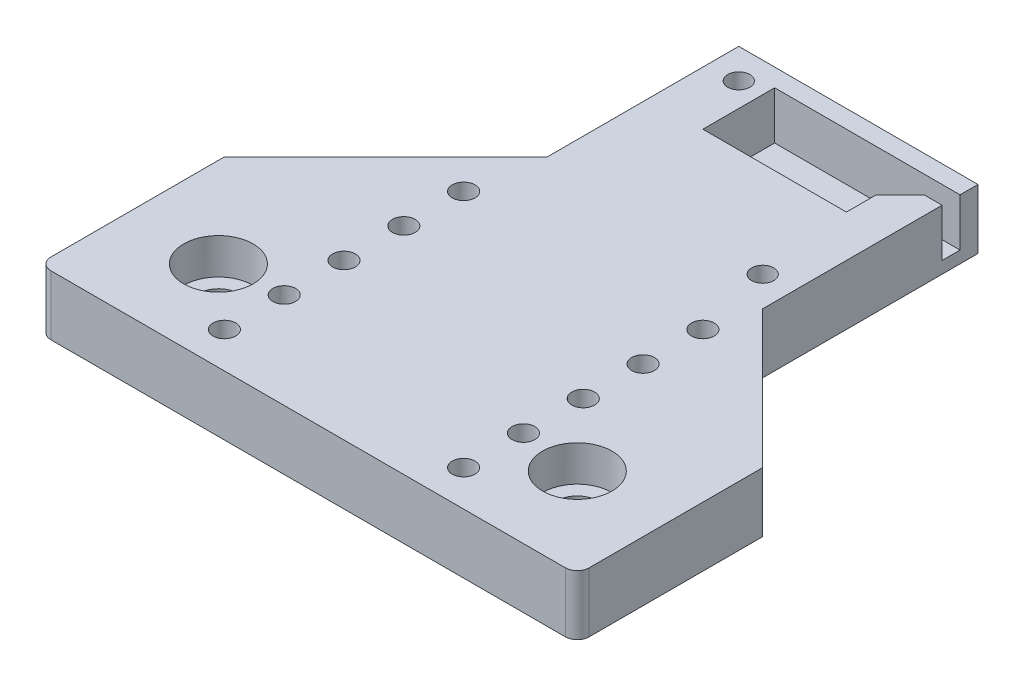
ISO-10303-21;
HEADER;
FILE_DESCRIPTION(('STEP AP214'),'2;1');
FILE_NAME('part.step','',(''),(''),'','','');
FILE_SCHEMA(('AUTOMOTIVE_DESIGN { 1 0 10303 214 1 1 1 1 }'));
ENDSEC;
DATA;
#1=APPLICATION_CONTEXT('core data for automotive mechanical design processes');
#2=APPLICATION_PROTOCOL_DEFINITION('international standard','automotive_design',2000,#1);
#3=PRODUCT_CONTEXT('',#1,'mechanical');
#4=PRODUCT('Part','Part','',(#3));
#5=PRODUCT_RELATED_PRODUCT_CATEGORY('part','',(#4));
#6=PRODUCT_DEFINITION_FORMATION('','',#4);
#7=PRODUCT_DEFINITION_CONTEXT('part definition',#1,'design');
#8=PRODUCT_DEFINITION('design','',#6,#7);
#9=PRODUCT_DEFINITION_SHAPE('','',#8);
#10=(LENGTH_UNIT() NAMED_UNIT(*) SI_UNIT(.MILLI.,.METRE.));
#11=(NAMED_UNIT(*) PLANE_ANGLE_UNIT() SI_UNIT($,.RADIAN.));
#12=(NAMED_UNIT(*) SI_UNIT($,.STERADIAN.) SOLID_ANGLE_UNIT());
#13=UNCERTAINTY_MEASURE_WITH_UNIT(LENGTH_MEASURE(1.E-05),#10,'distance_accuracy_value','');
#14=(GEOMETRIC_REPRESENTATION_CONTEXT(3) GLOBAL_UNCERTAINTY_ASSIGNED_CONTEXT((#13)) GLOBAL_UNIT_ASSIGNED_CONTEXT((#10,
#11,#12)) REPRESENTATION_CONTEXT('',''));
#15=CARTESIAN_POINT('',(0.,0.,0.));
#16=DIRECTION('',(0.,0.,1.));
#17=DIRECTION('',(1.,0.,0.));
#18=AXIS2_PLACEMENT_3D('',#15,#16,#17);
#19=CARTESIAN_POINT('',(0.,5.,0.));
#20=DIRECTION('',(0.,-1.,0.));
#21=DIRECTION('',(0.,0.,-1.));
#22=AXIS2_PLACEMENT_3D('',#19,#20,#21);
#23=PLANE('',#22);
#24=DIRECTION('',(0.,0.,-1.));
#25=VECTOR('',#24,1.);
#26=CARTESIAN_POINT('',(22.5,5.,22.5));
#27=LINE('',#26,#25);
#28=CARTESIAN_POINT('',(22.5,5.,21.5));
#29=VERTEX_POINT('',#28);
#30=CARTESIAN_POINT('',(22.5,5.,7.0000000000001));
#31=VERTEX_POINT('',#30);
#32=EDGE_CURVE('E188',#29,#31,#27,.T.);
#33=ORIENTED_EDGE('',*,*,#32,.T.);
#34=DIRECTION('',(0.707106781186544,0.,0.707106781186551));
#35=VECTOR('',#34,1.);
#36=CARTESIAN_POINT('',(11.,5.,-4.5));
#37=LINE('',#36,#35);
#38=CARTESIAN_POINT('',(11.,5.,-4.5));
#39=VERTEX_POINT('',#38);
#40=EDGE_CURVE('E161',#39,#31,#37,.T.);
#41=ORIENTED_EDGE('',*,*,#40,.F.);
#42=DIRECTION('',(0.,0.,1.));
#43=VECTOR('',#42,1.);
#44=CARTESIAN_POINT('',(11.,5.,-22.5));
#45=LINE('',#44,#43);
#46=CARTESIAN_POINT('',(11.,5.,-19.5));
#47=VERTEX_POINT('',#46);
#48=EDGE_CURVE('E393',#47,#39,#45,.T.);
#49=ORIENTED_EDGE('',*,*,#48,.F.);
#50=DIRECTION('',(1.,0.,0.));
#51=VECTOR('',#50,1.);
#52=CARTESIAN_POINT('',(15.5,5.,-19.5));
#53=LINE('',#52,#51);
#54=CARTESIAN_POINT('',(9.49999999999999,5.,-19.5));
#55=VERTEX_POINT('',#54);
#56=EDGE_CURVE('E291',#55,#47,#53,.T.);
#57=ORIENTED_EDGE('',*,*,#56,.F.);
#58=DIRECTION('',(0.707106781186545,0.,-0.70710678118655));
#59=VECTOR('',#58,1.);
#60=CARTESIAN_POINT('',(9.49999999999999,5.,-19.5));
#61=LINE('',#60,#59);
#62=CARTESIAN_POINT('',(7.5,5.,-17.5));
#63=VERTEX_POINT('',#62);
#64=EDGE_CURVE('E259',#55,#63,#61,.F.);
#65=ORIENTED_EDGE('',*,*,#64,.T.);
#66=DIRECTION('',(0.,0.,-1.));
#67=VECTOR('',#66,1.);
#68=CARTESIAN_POINT('',(7.5,5.,-19.5));
#69=LINE('',#68,#67);
#70=CARTESIAN_POINT('',(7.5,5.,-15.));
#71=VERTEX_POINT('',#70);
#72=EDGE_CURVE('E289',#71,#63,#69,.T.);
#73=ORIENTED_EDGE('',*,*,#72,.F.);
#74=DIRECTION('',(1.,0.,0.));
#75=VECTOR('',#74,1.);
#76=CARTESIAN_POINT('',(-4.5,5.,-15.));
#77=LINE('',#76,#75);
#78=CARTESIAN_POINT('',(-4.5,5.,-15.));
#79=VERTEX_POINT('',#78);
#80=EDGE_CURVE('E297',#79,#71,#77,.T.);
#81=ORIENTED_EDGE('',*,*,#80,.F.);
#82=DIRECTION('',(0.,0.,1.));
#83=VECTOR('',#82,1.);
#84=CARTESIAN_POINT('',(-4.5,5.,-21.));
#85=LINE('',#84,#83);
#86=CARTESIAN_POINT('',(-4.5,5.,-21.));
#87=VERTEX_POINT('',#86);
#88=EDGE_CURVE('E301',#87,#79,#85,.T.);
#89=ORIENTED_EDGE('',*,*,#88,.F.);
#90=DIRECTION('',(-1.,0.,0.));
#91=VECTOR('',#90,1.);
#92=CARTESIAN_POINT('',(-4.5,5.,-21.));
#93=LINE('',#92,#91);
#94=CARTESIAN_POINT('',(11.,5.,-21.));
#95=VERTEX_POINT('',#94);
#96=EDGE_CURVE('E299',#95,#87,#93,.T.);
#97=ORIENTED_EDGE('',*,*,#96,.F.);
#98=CARTESIAN_POINT('',(11.,5.,-22.5));
#99=VERTEX_POINT('',#98);
#100=EDGE_CURVE('E49',#99,#95,#45,.T.);
#101=ORIENTED_EDGE('',*,*,#100,.F.);
#102=DIRECTION('',(-1.,0.,0.));
#103=VECTOR('',#102,1.);
#104=CARTESIAN_POINT('',(-22.5,5.,-22.5));
#105=LINE('',#104,#103);
#106=CARTESIAN_POINT('',(-9.00000000000001,5.,-22.5));
#107=VERTEX_POINT('',#106);
#108=EDGE_CURVE('E169',#99,#107,#105,.T.);
#109=ORIENTED_EDGE('',*,*,#108,.T.);
#110=DIRECTION('',(0.,0.,-1.));
#111=VECTOR('',#110,1.);
#112=CARTESIAN_POINT('',(-9.00000000000001,5.,-22.5));
#113=LINE('',#112,#111);
#114=CARTESIAN_POINT('',(-9.00000000000001,5.,-6.49999999999985));
#115=VERTEX_POINT('',#114);
#116=EDGE_CURVE('E403',#115,#107,#113,.T.);
#117=ORIENTED_EDGE('',*,*,#116,.F.);
#118=DIRECTION('',(0.707106781186549,0.,-0.707106781186546));
#119=VECTOR('',#118,1.);
#120=CARTESIAN_POINT('',(-9.00000000000001,5.,-6.49999999999985));
#121=LINE('',#120,#119);
#122=CARTESIAN_POINT('',(-22.5,5.,7.0000000000001));
#123=VERTEX_POINT('',#122);
#124=EDGE_CURVE('E401',#123,#115,#121,.T.);
#125=ORIENTED_EDGE('',*,*,#124,.F.);
#126=DIRECTION('',(0.,0.,1.));
#127=VECTOR('',#126,1.);
#128=CARTESIAN_POINT('',(-22.5,5.,22.5));
#129=LINE('',#128,#127);
#130=CARTESIAN_POINT('',(-22.5,5.,21.5));
#131=VERTEX_POINT('',#130);
#132=EDGE_CURVE('E372',#123,#131,#129,.T.);
#133=ORIENTED_EDGE('',*,*,#132,.T.);
#134=CARTESIAN_POINT('',(-21.5,5.,21.5));
#135=DIRECTION('',(0.,-1.,0.));
#136=DIRECTION('',(0.,0.,-1.));
#137=AXIS2_PLACEMENT_3D('',#134,#135,#136);
#138=CIRCLE('',#137,1.);
#139=CARTESIAN_POINT('',(-21.5,5.,22.5));
#140=VERTEX_POINT('',#139);
#141=EDGE_CURVE('E246',#131,#140,#138,.F.);
#142=ORIENTED_EDGE('',*,*,#141,.T.);
#143=DIRECTION('',(1.,0.,0.));
#144=VECTOR('',#143,1.);
#145=CARTESIAN_POINT('',(-22.5,5.,22.5));
#146=LINE('',#145,#144);
#147=CARTESIAN_POINT('',(21.5,5.,22.5));
#148=VERTEX_POINT('',#147);
#149=EDGE_CURVE('E203',#140,#148,#146,.T.);
#150=ORIENTED_EDGE('',*,*,#149,.T.);
#151=CARTESIAN_POINT('',(21.5,5.,21.5));
#152=DIRECTION('',(0.,-1.,0.));
#153=DIRECTION('',(0.,0.,-1.));
#154=AXIS2_PLACEMENT_3D('',#151,#152,#153);
#155=CIRCLE('',#154,1.);
#156=EDGE_CURVE('E244',#148,#29,#155,.F.);
#157=ORIENTED_EDGE('',*,*,#156,.T.);
#158=EDGE_LOOP('',(#33,#41,#49,#57,#65,#73,#81,#89,#97,#101,#109,#117,#125,#133,#142,#150,#157));
#159=FACE_BOUND('',#158,.T.);
#160=CARTESIAN_POINT('',(-10.,5.,14.5));
#161=DIRECTION('',(0.,1.,0.));
#162=DIRECTION('',(0.,0.,1.));
#163=AXIS2_PLACEMENT_3D('',#160,#161,#162);
#164=CIRCLE('',#163,0.949999999999999);
#165=CARTESIAN_POINT('',(-10.,5.,15.45));
#166=VERTEX_POINT('',#165);
#167=EDGE_CURVE('E324',#166,#166,#164,.T.);
#168=ORIENTED_EDGE('',*,*,#167,.F.);
#169=EDGE_LOOP('',(#168));
#170=FACE_BOUND('',#169,.T.);
#171=CARTESIAN_POINT('',(10.,5.,14.5));
#172=DIRECTION('',(0.,1.,0.));
#173=DIRECTION('',(0.,0.,-1.));
#174=AXIS2_PLACEMENT_3D('',#171,#172,#173);
#175=CIRCLE('',#174,0.949999999999999);
#176=CARTESIAN_POINT('',(10.,5.,13.55));
#177=VERTEX_POINT('',#176);
#178=EDGE_CURVE('E330',#177,#177,#175,.T.);
#179=ORIENTED_EDGE('',*,*,#178,.F.);
#180=EDGE_LOOP('',(#179));
#181=FACE_BOUND('',#180,.T.);
#182=CARTESIAN_POINT('',(10.,5.,19.5));
#183=DIRECTION('',(0.,1.,0.));
#184=DIRECTION('',(0.,0.,-1.));
#185=AXIS2_PLACEMENT_3D('',#182,#183,#184);
#186=CIRCLE('',#185,0.949999999999999);
#187=CARTESIAN_POINT('',(10.,5.,18.55));
#188=VERTEX_POINT('',#187);
#189=EDGE_CURVE('E333',#188,#188,#186,.T.);
#190=ORIENTED_EDGE('',*,*,#189,.F.);
#191=EDGE_LOOP('',(#190));
#192=FACE_BOUND('',#191,.T.);
#193=CARTESIAN_POINT('',(-10.,5.,19.5));
#194=DIRECTION('',(0.,1.,0.));
#195=DIRECTION('',(0.,0.,1.));
#196=AXIS2_PLACEMENT_3D('',#193,#194,#195);
#197=CIRCLE('',#196,0.949999999999999);
#198=CARTESIAN_POINT('',(-10.,5.,20.45));
#199=VERTEX_POINT('',#198);
#200=EDGE_CURVE('E337',#199,#199,#197,.T.);
#201=ORIENTED_EDGE('',*,*,#200,.F.);
#202=EDGE_LOOP('',(#201));
#203=FACE_BOUND('',#202,.T.);
#204=CARTESIAN_POINT('',(8.49999999999999,5.,-7.));
#205=DIRECTION('',(0.,1.,0.));
#206=DIRECTION('',(0.,0.,1.));
#207=AXIS2_PLACEMENT_3D('',#204,#205,#206);
#208=CIRCLE('',#207,0.925000000000001);
#209=CARTESIAN_POINT('',(8.49999999999999,5.,-6.075));
#210=VERTEX_POINT('',#209);
#211=EDGE_CURVE('E343',#210,#210,#208,.T.);
#212=ORIENTED_EDGE('',*,*,#211,.F.);
#213=EDGE_LOOP('',(#212));
#214=FACE_BOUND('',#213,.T.);
#215=CARTESIAN_POINT('',(-6.50000000000001,5.,-20.));
#216=DIRECTION('',(0.,1.,0.));
#217=DIRECTION('',(0.,0.,1.));
#218=AXIS2_PLACEMENT_3D('',#215,#216,#217);
#219=CIRCLE('',#218,0.925);
#220=CARTESIAN_POINT('',(-6.50000000000001,5.,-19.075));
#221=VERTEX_POINT('',#220);
#222=EDGE_CURVE('E349',#221,#221,#219,.T.);
#223=ORIENTED_EDGE('',*,*,#222,.F.);
#224=EDGE_LOOP('',(#223));
#225=FACE_BOUND('',#224,.T.);
#226=CARTESIAN_POINT('',(15.,5.,15.));
#227=DIRECTION('',(0.,1.,0.));
#228=DIRECTION('',(0.,0.,1.));
#229=AXIS2_PLACEMENT_3D('',#226,#227,#228);
#230=CIRCLE('',#229,2.9);
#231=CARTESIAN_POINT('',(15.,5.,17.9));
#232=VERTEX_POINT('',#231);
#233=EDGE_CURVE('E355',#232,#232,#230,.T.);
#234=ORIENTED_EDGE('',*,*,#233,.F.);
#235=EDGE_LOOP('',(#234));
#236=FACE_BOUND('',#235,.T.);
#237=CARTESIAN_POINT('',(-15.,5.,15.));
#238=DIRECTION('',(0.,1.,0.));
#239=DIRECTION('',(0.,0.,1.));
#240=AXIS2_PLACEMENT_3D('',#237,#238,#239);
#241=CIRCLE('',#240,2.9);
#242=CARTESIAN_POINT('',(-15.,5.,17.9));
#243=VERTEX_POINT('',#242);
#244=EDGE_CURVE('E197',#243,#243,#241,.T.);
#245=ORIENTED_EDGE('',*,*,#244,.F.);
#246=EDGE_LOOP('',(#245));
#247=FACE_BOUND('',#246,.T.);
#248=CARTESIAN_POINT('',(10.,5.,9.49999999999999));
#249=DIRECTION('',(0.,1.,0.));
#250=DIRECTION('',(0.,0.,-1.));
#251=AXIS2_PLACEMENT_3D('',#248,#249,#250);
#252=CIRCLE('',#251,0.949999999999999);
#253=CARTESIAN_POINT('',(10.,5.,8.55));
#254=VERTEX_POINT('',#253);
#255=EDGE_CURVE('E202',#254,#254,#252,.T.);
#256=ORIENTED_EDGE('',*,*,#255,.F.);
#257=EDGE_LOOP('',(#256));
#258=FACE_BOUND('',#257,.T.);
#259=CARTESIAN_POINT('',(10.,5.,4.5));
#260=DIRECTION('',(0.,1.,0.));
#261=DIRECTION('',(0.,0.,-1.));
#262=AXIS2_PLACEMENT_3D('',#259,#260,#261);
#263=CIRCLE('',#262,0.949999999999999);
#264=CARTESIAN_POINT('',(10.,5.,3.55));
#265=VERTEX_POINT('',#264);
#266=EDGE_CURVE('E209',#265,#265,#263,.T.);
#267=ORIENTED_EDGE('',*,*,#266,.F.);
#268=EDGE_LOOP('',(#267));
#269=FACE_BOUND('',#268,.T.);
#270=CARTESIAN_POINT('',(10.,5.,-0.500000000000004));
#271=DIRECTION('',(0.,1.,0.));
#272=DIRECTION('',(0.,0.,-1.));
#273=AXIS2_PLACEMENT_3D('',#270,#271,#272);
#274=CIRCLE('',#273,0.949999999999999);
#275=CARTESIAN_POINT('',(10.,5.,-1.45));
#276=VERTEX_POINT('',#275);
#277=EDGE_CURVE('E215',#276,#276,#274,.T.);
#278=ORIENTED_EDGE('',*,*,#277,.F.);
#279=EDGE_LOOP('',(#278));
#280=FACE_BOUND('',#279,.T.);
#281=CARTESIAN_POINT('',(-10.,5.,9.5));
#282=DIRECTION('',(0.,1.,0.));
#283=DIRECTION('',(0.,0.,1.));
#284=AXIS2_PLACEMENT_3D('',#281,#282,#283);
#285=CIRCLE('',#284,0.949999999999999);
#286=CARTESIAN_POINT('',(-10.,5.,10.45));
#287=VERTEX_POINT('',#286);
#288=EDGE_CURVE('E221',#287,#287,#285,.T.);
#289=ORIENTED_EDGE('',*,*,#288,.F.);
#290=EDGE_LOOP('',(#289));
#291=FACE_BOUND('',#290,.T.);
#292=CARTESIAN_POINT('',(-10.,5.,4.5));
#293=DIRECTION('',(0.,1.,0.));
#294=DIRECTION('',(0.,0.,1.));
#295=AXIS2_PLACEMENT_3D('',#292,#293,#294);
#296=CIRCLE('',#295,0.949999999999999);
#297=CARTESIAN_POINT('',(-10.,5.,5.45));
#298=VERTEX_POINT('',#297);
#299=EDGE_CURVE('E227',#298,#298,#296,.T.);
#300=ORIENTED_EDGE('',*,*,#299,.F.);
#301=EDGE_LOOP('',(#300));
#302=FACE_BOUND('',#301,.T.);
#303=CARTESIAN_POINT('',(-10.,5.,-0.5));
#304=DIRECTION('',(0.,1.,0.));
#305=DIRECTION('',(0.,0.,1.));
#306=AXIS2_PLACEMENT_3D('',#303,#304,#305);
#307=CIRCLE('',#306,0.949999999999999);
#308=CARTESIAN_POINT('',(-10.,5.,0.449999999999999));
#309=VERTEX_POINT('',#308);
#310=EDGE_CURVE('E233',#309,#309,#307,.T.);
#311=ORIENTED_EDGE('',*,*,#310,.F.);
#312=EDGE_LOOP('',(#311));
#313=FACE_BOUND('',#312,.T.);
#314=ADVANCED_FACE('F34',(#159,#170,#181,#192,#203,#214,#225,#236,#247,#258,#269,#280,#291,#302,
#313),#23,.F.);
#315=CARTESIAN_POINT('',(0.,0.,0.));
#316=DIRECTION('',(0.,-1.,0.));
#317=DIRECTION('',(0.,0.,-1.));
#318=AXIS2_PLACEMENT_3D('',#315,#316,#317);
#319=PLANE('',#318);
#320=DIRECTION('',(0.707106781186544,0.,0.707106781186551));
#321=VECTOR('',#320,1.);
#322=CARTESIAN_POINT('',(11.,0.,-4.5));
#323=LINE('',#322,#321);
#324=CARTESIAN_POINT('',(11.,0.,-4.5));
#325=VERTEX_POINT('',#324);
#326=CARTESIAN_POINT('',(22.5,0.,7.0000000000001));
#327=VERTEX_POINT('',#326);
#328=EDGE_CURVE('E160',#325,#327,#323,.T.);
#329=ORIENTED_EDGE('',*,*,#328,.T.);
#330=DIRECTION('',(0.,0.,-1.));
#331=VECTOR('',#330,1.);
#332=CARTESIAN_POINT('',(22.5,0.,22.5));
#333=LINE('',#332,#331);
#334=CARTESIAN_POINT('',(22.5,0.,21.5));
#335=VERTEX_POINT('',#334);
#336=EDGE_CURVE('E177',#335,#327,#333,.T.);
#337=ORIENTED_EDGE('',*,*,#336,.F.);
#338=CARTESIAN_POINT('',(21.5,0.,21.5));
#339=DIRECTION('',(0.,-1.,0.));
#340=DIRECTION('',(0.,0.,-1.));
#341=AXIS2_PLACEMENT_3D('',#338,#339,#340);
#342=CIRCLE('',#341,1.);
#343=CARTESIAN_POINT('',(21.5,0.,22.5));
#344=VERTEX_POINT('',#343);
#345=EDGE_CURVE('E239',#335,#344,#342,.T.);
#346=ORIENTED_EDGE('',*,*,#345,.T.);
#347=DIRECTION('',(1.,0.,0.));
#348=VECTOR('',#347,1.);
#349=CARTESIAN_POINT('',(-22.5,0.,22.5));
#350=LINE('',#349,#348);
#351=CARTESIAN_POINT('',(-21.5,0.,22.5));
#352=VERTEX_POINT('',#351);
#353=EDGE_CURVE('E179',#352,#344,#350,.T.);
#354=ORIENTED_EDGE('',*,*,#353,.F.);
#355=CARTESIAN_POINT('',(-21.5,0.,21.5));
#356=DIRECTION('',(0.,-1.,0.));
#357=DIRECTION('',(0.,0.,-1.));
#358=AXIS2_PLACEMENT_3D('',#355,#356,#357);
#359=CIRCLE('',#358,1.);
#360=CARTESIAN_POINT('',(-22.5,0.,21.5));
#361=VERTEX_POINT('',#360);
#362=EDGE_CURVE('E241',#352,#361,#359,.T.);
#363=ORIENTED_EDGE('',*,*,#362,.T.);
#364=DIRECTION('',(0.,0.,1.));
#365=VECTOR('',#364,1.);
#366=CARTESIAN_POINT('',(-22.5,0.,22.5));
#367=LINE('',#366,#365);
#368=CARTESIAN_POINT('',(-22.5,0.,7.00000000000011));
#369=VERTEX_POINT('',#368);
#370=EDGE_CURVE('E176',#369,#361,#367,.T.);
#371=ORIENTED_EDGE('',*,*,#370,.F.);
#372=DIRECTION('',(0.707106781186549,0.,-0.707106781186546));
#373=VECTOR('',#372,1.);
#374=CARTESIAN_POINT('',(-9.00000000000001,0.,-6.49999999999985));
#375=LINE('',#374,#373);
#376=CARTESIAN_POINT('',(-9.00000000000001,0.,-6.49999999999985));
#377=VERTEX_POINT('',#376);
#378=EDGE_CURVE('E56',#369,#377,#375,.T.);
#379=ORIENTED_EDGE('',*,*,#378,.T.);
#380=DIRECTION('',(0.,0.,-1.));
#381=VECTOR('',#380,1.);
#382=CARTESIAN_POINT('',(-9.00000000000001,0.,-22.5));
#383=LINE('',#382,#381);
#384=CARTESIAN_POINT('',(-9.00000000000001,0.,-22.5));
#385=VERTEX_POINT('',#384);
#386=EDGE_CURVE('E175',#377,#385,#383,.T.);
#387=ORIENTED_EDGE('',*,*,#386,.T.);
#388=DIRECTION('',(-1.,0.,0.));
#389=VECTOR('',#388,1.);
#390=CARTESIAN_POINT('',(-22.5,0.,-22.5));
#391=LINE('',#390,#389);
#392=CARTESIAN_POINT('',(11.,0.,-22.5));
#393=VERTEX_POINT('',#392);
#394=EDGE_CURVE('E167',#393,#385,#391,.T.);
#395=ORIENTED_EDGE('',*,*,#394,.F.);
#396=DIRECTION('',(0.,0.,1.));
#397=VECTOR('',#396,1.);
#398=CARTESIAN_POINT('',(11.,0.,-22.5));
#399=LINE('',#398,#397);
#400=EDGE_CURVE('E150',#393,#325,#399,.T.);
#401=ORIENTED_EDGE('',*,*,#400,.T.);
#402=EDGE_LOOP('',(#329,#337,#346,#354,#363,#371,#379,#387,#395,#401));
#403=FACE_BOUND('',#402,.T.);
#404=CARTESIAN_POINT('',(-10.,0.,14.5));
#405=DIRECTION('',(0.,1.,0.));
#406=DIRECTION('',(0.,0.,1.));
#407=AXIS2_PLACEMENT_3D('',#404,#405,#406);
#408=CIRCLE('',#407,0.949999999999999);
#409=CARTESIAN_POINT('',(-10.,0.,15.45));
#410=VERTEX_POINT('',#409);
#411=EDGE_CURVE('E321',#410,#410,#408,.T.);
#412=ORIENTED_EDGE('',*,*,#411,.T.);
#413=EDGE_LOOP('',(#412));
#414=FACE_BOUND('',#413,.T.);
#415=CARTESIAN_POINT('',(10.,0.,14.5));
#416=DIRECTION('',(0.,1.,0.));
#417=DIRECTION('',(0.,0.,-1.));
#418=AXIS2_PLACEMENT_3D('',#415,#416,#417);
#419=CIRCLE('',#418,0.949999999999999);
#420=CARTESIAN_POINT('',(10.,0.,13.55));
#421=VERTEX_POINT('',#420);
#422=EDGE_CURVE('E327',#421,#421,#419,.T.);
#423=ORIENTED_EDGE('',*,*,#422,.T.);
#424=EDGE_LOOP('',(#423));
#425=FACE_BOUND('',#424,.T.);
#426=CARTESIAN_POINT('',(10.,0.,19.5));
#427=DIRECTION('',(0.,1.,0.));
#428=DIRECTION('',(0.,0.,-1.));
#429=AXIS2_PLACEMENT_3D('',#426,#427,#428);
#430=CIRCLE('',#429,0.949999999999999);
#431=CARTESIAN_POINT('',(10.,0.,18.55));
#432=VERTEX_POINT('',#431);
#433=EDGE_CURVE('E334',#432,#432,#430,.T.);
#434=ORIENTED_EDGE('',*,*,#433,.T.);
#435=EDGE_LOOP('',(#434));
#436=FACE_BOUND('',#435,.T.);
#437=CARTESIAN_POINT('',(-10.,0.,19.5));
#438=DIRECTION('',(0.,1.,0.));
#439=DIRECTION('',(0.,0.,1.));
#440=AXIS2_PLACEMENT_3D('',#437,#438,#439);
#441=CIRCLE('',#440,0.949999999999999);
#442=CARTESIAN_POINT('',(-10.,0.,20.45));
#443=VERTEX_POINT('',#442);
#444=EDGE_CURVE('E340',#443,#443,#441,.T.);
#445=ORIENTED_EDGE('',*,*,#444,.T.);
#446=EDGE_LOOP('',(#445));
#447=FACE_BOUND('',#446,.T.);
#448=CARTESIAN_POINT('',(8.49999999999999,0.,-7.));
#449=DIRECTION('',(0.,1.,0.));
#450=DIRECTION('',(0.,0.,1.));
#451=AXIS2_PLACEMENT_3D('',#448,#449,#450);
#452=CIRCLE('',#451,0.925000000000001);
#453=CARTESIAN_POINT('',(8.49999999999999,0.,-6.075));
#454=VERTEX_POINT('',#453);
#455=EDGE_CURVE('E346',#454,#454,#452,.T.);
#456=ORIENTED_EDGE('',*,*,#455,.T.);
#457=EDGE_LOOP('',(#456));
#458=FACE_BOUND('',#457,.T.);
#459=CARTESIAN_POINT('',(-6.50000000000001,0.,-20.));
#460=DIRECTION('',(0.,1.,0.));
#461=DIRECTION('',(0.,0.,1.));
#462=AXIS2_PLACEMENT_3D('',#459,#460,#461);
#463=CIRCLE('',#462,0.925);
#464=CARTESIAN_POINT('',(-6.50000000000001,0.,-19.075));
#465=VERTEX_POINT('',#464);
#466=EDGE_CURVE('E352',#465,#465,#463,.T.);
#467=ORIENTED_EDGE('',*,*,#466,.T.);
#468=EDGE_LOOP('',(#467));
#469=FACE_BOUND('',#468,.T.);
#470=CARTESIAN_POINT('',(15.,0.,15.));
#471=DIRECTION('',(0.,1.,0.));
#472=DIRECTION('',(0.,0.,-1.));
#473=AXIS2_PLACEMENT_3D('',#470,#471,#472);
#474=CIRCLE('',#473,1.7);
#475=CARTESIAN_POINT('',(15.,0.,13.3));
#476=VERTEX_POINT('',#475);
#477=EDGE_CURVE('E192',#476,#476,#474,.T.);
#478=ORIENTED_EDGE('',*,*,#477,.T.);
#479=EDGE_LOOP('',(#478));
#480=FACE_BOUND('',#479,.T.);
#481=CARTESIAN_POINT('',(-15.,0.,15.));
#482=DIRECTION('',(0.,1.,0.));
#483=DIRECTION('',(0.,0.,1.));
#484=AXIS2_PLACEMENT_3D('',#481,#482,#483);
#485=CIRCLE('',#484,1.7);
#486=CARTESIAN_POINT('',(-15.,0.,16.7));
#487=VERTEX_POINT('',#486);
#488=EDGE_CURVE('E182',#487,#487,#485,.T.);
#489=ORIENTED_EDGE('',*,*,#488,.T.);
#490=EDGE_LOOP('',(#489));
#491=FACE_BOUND('',#490,.T.);
#492=CARTESIAN_POINT('',(10.,0.,9.49999999999999));
#493=DIRECTION('',(0.,1.,0.));
#494=DIRECTION('',(0.,0.,-1.));
#495=AXIS2_PLACEMENT_3D('',#492,#493,#494);
#496=CIRCLE('',#495,0.949999999999999);
#497=CARTESIAN_POINT('',(10.,0.,8.55));
#498=VERTEX_POINT('',#497);
#499=EDGE_CURVE('E199',#498,#498,#496,.T.);
#500=ORIENTED_EDGE('',*,*,#499,.T.);
#501=EDGE_LOOP('',(#500));
#502=FACE_BOUND('',#501,.T.);
#503=CARTESIAN_POINT('',(10.,0.,4.5));
#504=DIRECTION('',(0.,1.,0.));
#505=DIRECTION('',(0.,0.,-1.));
#506=AXIS2_PLACEMENT_3D('',#503,#504,#505);
#507=CIRCLE('',#506,0.949999999999999);
#508=CARTESIAN_POINT('',(10.,0.,3.55));
#509=VERTEX_POINT('',#508);
#510=EDGE_CURVE('E206',#509,#509,#507,.T.);
#511=ORIENTED_EDGE('',*,*,#510,.T.);
#512=EDGE_LOOP('',(#511));
#513=FACE_BOUND('',#512,.T.);
#514=CARTESIAN_POINT('',(10.,0.,-0.500000000000004));
#515=DIRECTION('',(0.,1.,0.));
#516=DIRECTION('',(0.,0.,-1.));
#517=AXIS2_PLACEMENT_3D('',#514,#515,#516);
#518=CIRCLE('',#517,0.949999999999999);
#519=CARTESIAN_POINT('',(10.,0.,-1.45));
#520=VERTEX_POINT('',#519);
#521=EDGE_CURVE('E212',#520,#520,#518,.T.);
#522=ORIENTED_EDGE('',*,*,#521,.T.);
#523=EDGE_LOOP('',(#522));
#524=FACE_BOUND('',#523,.T.);
#525=CARTESIAN_POINT('',(-10.,0.,9.5));
#526=DIRECTION('',(0.,1.,0.));
#527=DIRECTION('',(0.,0.,1.));
#528=AXIS2_PLACEMENT_3D('',#525,#526,#527);
#529=CIRCLE('',#528,0.949999999999999);
#530=CARTESIAN_POINT('',(-10.,0.,10.45));
#531=VERTEX_POINT('',#530);
#532=EDGE_CURVE('E218',#531,#531,#529,.T.);
#533=ORIENTED_EDGE('',*,*,#532,.T.);
#534=EDGE_LOOP('',(#533));
#535=FACE_BOUND('',#534,.T.);
#536=CARTESIAN_POINT('',(-10.,0.,4.5));
#537=DIRECTION('',(0.,1.,0.));
#538=DIRECTION('',(0.,0.,1.));
#539=AXIS2_PLACEMENT_3D('',#536,#537,#538);
#540=CIRCLE('',#539,0.949999999999999);
#541=CARTESIAN_POINT('',(-10.,0.,5.45));
#542=VERTEX_POINT('',#541);
#543=EDGE_CURVE('E224',#542,#542,#540,.T.);
#544=ORIENTED_EDGE('',*,*,#543,.T.);
#545=EDGE_LOOP('',(#544));
#546=FACE_BOUND('',#545,.T.);
#547=CARTESIAN_POINT('',(-10.,0.,-0.5));
#548=DIRECTION('',(0.,1.,0.));
#549=DIRECTION('',(0.,0.,1.));
#550=AXIS2_PLACEMENT_3D('',#547,#548,#549);
#551=CIRCLE('',#550,0.949999999999999);
#552=CARTESIAN_POINT('',(-10.,0.,0.449999999999999));
#553=VERTEX_POINT('',#552);
#554=EDGE_CURVE('E230',#553,#553,#551,.T.);
#555=ORIENTED_EDGE('',*,*,#554,.T.);
#556=EDGE_LOOP('',(#555));
#557=FACE_BOUND('',#556,.T.);
#558=ADVANCED_FACE('F172',(#403,#414,#425,#436,#447,#458,#469,#480,#491,#502,#513,#524,#535,
#546,#557),#319,.T.);
#559=CARTESIAN_POINT('',(22.5,5.,22.5));
#560=DIRECTION('',(-1.,0.,0.));
#561=DIRECTION('',(0.,0.,1.));
#562=AXIS2_PLACEMENT_3D('',#559,#560,#561);
#563=PLANE('',#562);
#564=ORIENTED_EDGE('',*,*,#336,.T.);
#565=DIRECTION('',(0.,1.,0.));
#566=VECTOR('',#565,1.);
#567=CARTESIAN_POINT('',(22.5,0.,7.0000000000001));
#568=LINE('',#567,#566);
#569=EDGE_CURVE('E395',#327,#31,#568,.T.);
#570=ORIENTED_EDGE('',*,*,#569,.T.);
#571=ORIENTED_EDGE('',*,*,#32,.F.);
#572=DIRECTION('',(0.,-1.,0.));
#573=VECTOR('',#572,1.);
#574=CARTESIAN_POINT('',(22.5,5.,21.5));
#575=LINE('',#574,#573);
#576=EDGE_CURVE('E253',#29,#335,#575,.T.);
#577=ORIENTED_EDGE('',*,*,#576,.T.);
#578=EDGE_LOOP('',(#564,#570,#571,#577));
#579=FACE_BOUND('',#578,.T.);
#580=ADVANCED_FACE('F386',(#579),#563,.F.);
#581=CARTESIAN_POINT('',(-22.5,5.,-22.5));
#582=DIRECTION('',(0.,0.,1.));
#583=DIRECTION('',(1.,0.,0.));
#584=AXIS2_PLACEMENT_3D('',#581,#582,#583);
#585=PLANE('',#584);
#586=ORIENTED_EDGE('',*,*,#108,.F.);
#587=DIRECTION('',(0.,1.,0.));
#588=VECTOR('',#587,1.);
#589=CARTESIAN_POINT('',(11.,0.,-22.5));
#590=LINE('',#589,#588);
#591=EDGE_CURVE('E153',#393,#99,#590,.T.);
#592=ORIENTED_EDGE('',*,*,#591,.F.);
#593=ORIENTED_EDGE('',*,*,#394,.T.);
#594=DIRECTION('',(0.,1.,0.));
#595=VECTOR('',#594,1.);
#596=CARTESIAN_POINT('',(-9.00000000000001,0.,-22.5));
#597=LINE('',#596,#595);
#598=EDGE_CURVE('E307',#385,#107,#597,.T.);
#599=ORIENTED_EDGE('',*,*,#598,.T.);
#600=EDGE_LOOP('',(#586,#592,#593,#599));
#601=FACE_BOUND('',#600,.T.);
#602=ADVANCED_FACE('F165',(#601),#585,.F.);
#603=CARTESIAN_POINT('',(-22.5,5.,22.5));
#604=DIRECTION('',(1.,0.,0.));
#605=DIRECTION('',(0.,0.,-1.));
#606=AXIS2_PLACEMENT_3D('',#603,#604,#605);
#607=PLANE('',#606);
#608=ORIENTED_EDGE('',*,*,#132,.F.);
#609=DIRECTION('',(0.,1.,0.));
#610=VECTOR('',#609,1.);
#611=CARTESIAN_POINT('',(-22.5,0.,7.0000000000001));
#612=LINE('',#611,#610);
#613=EDGE_CURVE('E405',#369,#123,#612,.T.);
#614=ORIENTED_EDGE('',*,*,#613,.F.);
#615=ORIENTED_EDGE('',*,*,#370,.T.);
#616=DIRECTION('',(0.,-1.,0.));
#617=VECTOR('',#616,1.);
#618=CARTESIAN_POINT('',(-22.5,5.,21.5));
#619=LINE('',#618,#617);
#620=EDGE_CURVE('E236',#361,#131,#619,.F.);
#621=ORIENTED_EDGE('',*,*,#620,.T.);
#622=EDGE_LOOP('',(#608,#614,#615,#621));
#623=FACE_BOUND('',#622,.T.);
#624=ADVANCED_FACE('F447',(#623),#607,.F.);
#625=CARTESIAN_POINT('',(-22.5,5.,22.5));
#626=DIRECTION('',(0.,0.,-1.));
#627=DIRECTION('',(-1.,0.,0.));
#628=AXIS2_PLACEMENT_3D('',#625,#626,#627);
#629=PLANE('',#628);
#630=ORIENTED_EDGE('',*,*,#149,.F.);
#631=DIRECTION('',(0.,-1.,0.));
#632=VECTOR('',#631,1.);
#633=CARTESIAN_POINT('',(-21.5,5.,22.5));
#634=LINE('',#633,#632);
#635=EDGE_CURVE('E250',#140,#352,#634,.T.);
#636=ORIENTED_EDGE('',*,*,#635,.T.);
#637=ORIENTED_EDGE('',*,*,#353,.T.);
#638=DIRECTION('',(0.,-1.,0.));
#639=VECTOR('',#638,1.);
#640=CARTESIAN_POINT('',(21.5,5.,22.5));
#641=LINE('',#640,#639);
#642=EDGE_CURVE('E248',#344,#148,#641,.F.);
#643=ORIENTED_EDGE('',*,*,#642,.T.);
#644=EDGE_LOOP('',(#630,#636,#637,#643));
#645=FACE_BOUND('',#644,.T.);
#646=ADVANCED_FACE('F444',(#645),#629,.F.);
#647=CARTESIAN_POINT('',(-15.,5.,15.));
#648=DIRECTION('',(0.,-1.,0.));
#649=DIRECTION('',(0.,0.,-1.));
#650=AXIS2_PLACEMENT_3D('',#647,#648,#649);
#651=CYLINDRICAL_SURFACE('',#650,1.7);
#652=CARTESIAN_POINT('',(-15.,2.,15.));
#653=DIRECTION('',(0.,-1.,0.));
#654=DIRECTION('',(0.,0.,-1.));
#655=AXIS2_PLACEMENT_3D('',#652,#653,#654);
#656=CIRCLE('',#655,1.7);
#657=CARTESIAN_POINT('',(-15.,2.,13.3));
#658=VERTEX_POINT('',#657);
#659=EDGE_CURVE('E189',#658,#658,#656,.T.);
#660=ORIENTED_EDGE('',*,*,#659,.F.);
#661=EDGE_LOOP('',(#660));
#662=FACE_BOUND('',#661,.T.);
#663=ORIENTED_EDGE('',*,*,#488,.F.);
#664=EDGE_LOOP('',(#663));
#665=FACE_BOUND('',#664,.T.);
#666=ADVANCED_FACE('F441',(#662,#665),#651,.F.);
#667=CARTESIAN_POINT('',(15.,5.,15.));
#668=DIRECTION('',(0.,-1.,0.));
#669=DIRECTION('',(0.,0.,-1.));
#670=AXIS2_PLACEMENT_3D('',#667,#668,#669);
#671=CYLINDRICAL_SURFACE('',#670,1.7);
#672=CARTESIAN_POINT('',(15.,2.,15.));
#673=DIRECTION('',(0.,-1.,0.));
#674=DIRECTION('',(0.,0.,-1.));
#675=AXIS2_PLACEMENT_3D('',#672,#673,#674);
#676=CIRCLE('',#675,1.7);
#677=CARTESIAN_POINT('',(15.,2.,13.3));
#678=VERTEX_POINT('',#677);
#679=EDGE_CURVE('E194',#678,#678,#676,.T.);
#680=ORIENTED_EDGE('',*,*,#679,.F.);
#681=EDGE_LOOP('',(#680));
#682=FACE_BOUND('',#681,.T.);
#683=ORIENTED_EDGE('',*,*,#477,.F.);
#684=EDGE_LOOP('',(#683));
#685=FACE_BOUND('',#684,.T.);
#686=ADVANCED_FACE('F531',(#682,#685),#671,.F.);
#687=CARTESIAN_POINT('',(0.,2.,0.));
#688=DIRECTION('',(0.,-1.,0.));
#689=DIRECTION('',(0.,0.,-1.));
#690=AXIS2_PLACEMENT_3D('',#687,#688,#689);
#691=PLANE('',#690);
#692=ORIENTED_EDGE('',*,*,#659,.T.);
#693=EDGE_LOOP('',(#692));
#694=FACE_BOUND('',#693,.T.);
#695=CARTESIAN_POINT('',(-15.,2.,15.));
#696=DIRECTION('',(0.,-1.,0.));
#697=DIRECTION('',(0.,0.,-1.));
#698=AXIS2_PLACEMENT_3D('',#695,#696,#697);
#699=CIRCLE('',#698,2.9);
#700=CARTESIAN_POINT('',(-15.,2.,12.1));
#701=VERTEX_POINT('',#700);
#702=EDGE_CURVE('E193',#701,#701,#699,.F.);
#703=ORIENTED_EDGE('',*,*,#702,.T.);
#704=EDGE_LOOP('',(#703));
#705=FACE_BOUND('',#704,.T.);
#706=ADVANCED_FACE('F528',(#694,#705),#691,.F.);
#707=CARTESIAN_POINT('',(-15.,-8.20243866176395,15.));
#708=DIRECTION('',(0.,1.,0.));
#709=DIRECTION('',(0.,0.,1.));
#710=AXIS2_PLACEMENT_3D('',#707,#708,#709);
#711=CYLINDRICAL_SURFACE('',#710,2.9);
#712=ORIENTED_EDGE('',*,*,#244,.T.);
#713=EDGE_LOOP('',(#712));
#714=FACE_BOUND('',#713,.T.);
#715=ORIENTED_EDGE('',*,*,#702,.F.);
#716=EDGE_LOOP('',(#715));
#717=FACE_BOUND('',#716,.T.);
#718=ADVANCED_FACE('F524',(#714,#717),#711,.F.);
#719=CARTESIAN_POINT('',(0.,2.,0.));
#720=DIRECTION('',(0.,-1.,0.));
#721=DIRECTION('',(0.,0.,-1.));
#722=AXIS2_PLACEMENT_3D('',#719,#720,#721);
#723=PLANE('',#722);
#724=ORIENTED_EDGE('',*,*,#679,.T.);
#725=EDGE_LOOP('',(#724));
#726=FACE_BOUND('',#725,.T.);
#727=CARTESIAN_POINT('',(15.,2.,15.));
#728=DIRECTION('',(0.,-1.,0.));
#729=DIRECTION('',(0.,0.,-1.));
#730=AXIS2_PLACEMENT_3D('',#727,#728,#729);
#731=CIRCLE('',#730,2.9);
#732=CARTESIAN_POINT('',(15.,2.,12.1));
#733=VERTEX_POINT('',#732);
#734=EDGE_CURVE('E198',#733,#733,#731,.F.);
#735=ORIENTED_EDGE('',*,*,#734,.T.);
#736=EDGE_LOOP('',(#735));
#737=FACE_BOUND('',#736,.T.);
#738=ADVANCED_FACE('F520',(#726,#737),#723,.F.);
#739=CARTESIAN_POINT('',(15.,-8.20243866176395,15.));
#740=DIRECTION('',(0.,1.,0.));
#741=DIRECTION('',(0.,0.,1.));
#742=AXIS2_PLACEMENT_3D('',#739,#740,#741);
#743=CYLINDRICAL_SURFACE('',#742,2.9);
#744=ORIENTED_EDGE('',*,*,#233,.T.);
#745=EDGE_LOOP('',(#744));
#746=FACE_BOUND('',#745,.T.);
#747=ORIENTED_EDGE('',*,*,#734,.F.);
#748=EDGE_LOOP('',(#747));
#749=FACE_BOUND('',#748,.T.);
#750=ADVANCED_FACE('F516',(#746,#749),#743,.F.);
#751=CARTESIAN_POINT('',(-6.50000000000001,0.,-20.));
#752=DIRECTION('',(0.,1.,0.));
#753=DIRECTION('',(0.,0.,1.));
#754=AXIS2_PLACEMENT_3D('',#751,#752,#753);
#755=CYLINDRICAL_SURFACE('',#754,0.925);
#756=ORIENTED_EDGE('',*,*,#466,.F.);
#757=EDGE_LOOP('',(#756));
#758=FACE_BOUND('',#757,.T.);
#759=ORIENTED_EDGE('',*,*,#222,.T.);
#760=EDGE_LOOP('',(#759));
#761=FACE_BOUND('',#760,.T.);
#762=ADVANCED_FACE('F512',(#758,#761),#755,.F.);
#763=CARTESIAN_POINT('',(8.49999999999999,0.,-7.));
#764=DIRECTION('',(0.,1.,0.));
#765=DIRECTION('',(0.,0.,1.));
#766=AXIS2_PLACEMENT_3D('',#763,#764,#765);
#767=CYLINDRICAL_SURFACE('',#766,0.925000000000001);
#768=ORIENTED_EDGE('',*,*,#455,.F.);
#769=EDGE_LOOP('',(#768));
#770=FACE_BOUND('',#769,.T.);
#771=ORIENTED_EDGE('',*,*,#211,.T.);
#772=EDGE_LOOP('',(#771));
#773=FACE_BOUND('',#772,.T.);
#774=ADVANCED_FACE('F508',(#770,#773),#767,.F.);
#775=CARTESIAN_POINT('',(-10.,0.,19.5));
#776=DIRECTION('',(0.,1.,0.));
#777=DIRECTION('',(0.,0.,1.));
#778=AXIS2_PLACEMENT_3D('',#775,#776,#777);
#779=CYLINDRICAL_SURFACE('',#778,0.949999999999999);
#780=ORIENTED_EDGE('',*,*,#444,.F.);
#781=EDGE_LOOP('',(#780));
#782=FACE_BOUND('',#781,.T.);
#783=ORIENTED_EDGE('',*,*,#200,.T.);
#784=EDGE_LOOP('',(#783));
#785=FACE_BOUND('',#784,.T.);
#786=ADVANCED_FACE('F504',(#782,#785),#779,.F.);
#787=CARTESIAN_POINT('',(10.,0.,19.5));
#788=DIRECTION('',(0.,1.,0.));
#789=DIRECTION('',(0.,0.,1.));
#790=AXIS2_PLACEMENT_3D('',#787,#788,#789);
#791=CYLINDRICAL_SURFACE('',#790,0.949999999999999);
#792=ORIENTED_EDGE('',*,*,#433,.F.);
#793=EDGE_LOOP('',(#792));
#794=FACE_BOUND('',#793,.T.);
#795=ORIENTED_EDGE('',*,*,#189,.T.);
#796=EDGE_LOOP('',(#795));
#797=FACE_BOUND('',#796,.T.);
#798=ADVANCED_FACE('F500',(#794,#797),#791,.F.);
#799=CARTESIAN_POINT('',(10.,0.,14.5));
#800=DIRECTION('',(0.,1.,0.));
#801=DIRECTION('',(0.,0.,1.));
#802=AXIS2_PLACEMENT_3D('',#799,#800,#801);
#803=CYLINDRICAL_SURFACE('',#802,0.949999999999999);
#804=ORIENTED_EDGE('',*,*,#422,.F.);
#805=EDGE_LOOP('',(#804));
#806=FACE_BOUND('',#805,.T.);
#807=ORIENTED_EDGE('',*,*,#178,.T.);
#808=EDGE_LOOP('',(#807));
#809=FACE_BOUND('',#808,.T.);
#810=ADVANCED_FACE('F459',(#806,#809),#803,.F.);
#811=CARTESIAN_POINT('',(10.,0.,9.49999999999999));
#812=DIRECTION('',(0.,1.,0.));
#813=DIRECTION('',(0.,0.,1.));
#814=AXIS2_PLACEMENT_3D('',#811,#812,#813);
#815=CYLINDRICAL_SURFACE('',#814,0.949999999999999);
#816=ORIENTED_EDGE('',*,*,#499,.F.);
#817=EDGE_LOOP('',(#816));
#818=FACE_BOUND('',#817,.T.);
#819=ORIENTED_EDGE('',*,*,#255,.T.);
#820=EDGE_LOOP('',(#819));
#821=FACE_BOUND('',#820,.T.);
#822=ADVANCED_FACE('F455',(#818,#821),#815,.F.);
#823=CARTESIAN_POINT('',(10.,0.,4.5));
#824=DIRECTION('',(0.,1.,0.));
#825=DIRECTION('',(0.,0.,1.));
#826=AXIS2_PLACEMENT_3D('',#823,#824,#825);
#827=CYLINDRICAL_SURFACE('',#826,0.949999999999999);
#828=ORIENTED_EDGE('',*,*,#510,.F.);
#829=EDGE_LOOP('',(#828));
#830=FACE_BOUND('',#829,.T.);
#831=ORIENTED_EDGE('',*,*,#266,.T.);
#832=EDGE_LOOP('',(#831));
#833=FACE_BOUND('',#832,.T.);
#834=ADVANCED_FACE('F458',(#830,#833),#827,.F.);
#835=CARTESIAN_POINT('',(10.,0.,-0.500000000000004));
#836=DIRECTION('',(0.,1.,0.));
#837=DIRECTION('',(0.,0.,1.));
#838=AXIS2_PLACEMENT_3D('',#835,#836,#837);
#839=CYLINDRICAL_SURFACE('',#838,0.949999999999999);
#840=ORIENTED_EDGE('',*,*,#521,.F.);
#841=EDGE_LOOP('',(#840));
#842=FACE_BOUND('',#841,.T.);
#843=ORIENTED_EDGE('',*,*,#277,.T.);
#844=EDGE_LOOP('',(#843));
#845=FACE_BOUND('',#844,.T.);
#846=ADVANCED_FACE('F463',(#842,#845),#839,.F.);
#847=CARTESIAN_POINT('',(-10.,0.,14.5));
#848=DIRECTION('',(0.,1.,0.));
#849=DIRECTION('',(0.,0.,1.));
#850=AXIS2_PLACEMENT_3D('',#847,#848,#849);
#851=CYLINDRICAL_SURFACE('',#850,0.949999999999999);
#852=ORIENTED_EDGE('',*,*,#411,.F.);
#853=EDGE_LOOP('',(#852));
#854=FACE_BOUND('',#853,.T.);
#855=ORIENTED_EDGE('',*,*,#167,.T.);
#856=EDGE_LOOP('',(#855));
#857=FACE_BOUND('',#856,.T.);
#858=ADVANCED_FACE('F467',(#854,#857),#851,.F.);
#859=CARTESIAN_POINT('',(-10.,0.,9.5));
#860=DIRECTION('',(0.,1.,0.));
#861=DIRECTION('',(0.,0.,1.));
#862=AXIS2_PLACEMENT_3D('',#859,#860,#861);
#863=CYLINDRICAL_SURFACE('',#862,0.949999999999999);
#864=ORIENTED_EDGE('',*,*,#532,.F.);
#865=EDGE_LOOP('',(#864));
#866=FACE_BOUND('',#865,.T.);
#867=ORIENTED_EDGE('',*,*,#288,.T.);
#868=EDGE_LOOP('',(#867));
#869=FACE_BOUND('',#868,.T.);
#870=ADVANCED_FACE('F469',(#866,#869),#863,.F.);
#871=CARTESIAN_POINT('',(-10.,0.,4.5));
#872=DIRECTION('',(0.,1.,0.));
#873=DIRECTION('',(0.,0.,1.));
#874=AXIS2_PLACEMENT_3D('',#871,#872,#873);
#875=CYLINDRICAL_SURFACE('',#874,0.949999999999999);
#876=ORIENTED_EDGE('',*,*,#543,.F.);
#877=EDGE_LOOP('',(#876));
#878=FACE_BOUND('',#877,.T.);
#879=ORIENTED_EDGE('',*,*,#299,.T.);
#880=EDGE_LOOP('',(#879));
#881=FACE_BOUND('',#880,.T.);
#882=ADVANCED_FACE('F472',(#878,#881),#875,.F.);
#883=CARTESIAN_POINT('',(-10.,0.,-0.5));
#884=DIRECTION('',(0.,1.,0.));
#885=DIRECTION('',(0.,0.,1.));
#886=AXIS2_PLACEMENT_3D('',#883,#884,#885);
#887=CYLINDRICAL_SURFACE('',#886,0.949999999999999);
#888=ORIENTED_EDGE('',*,*,#554,.F.);
#889=EDGE_LOOP('',(#888));
#890=FACE_BOUND('',#889,.T.);
#891=ORIENTED_EDGE('',*,*,#310,.T.);
#892=EDGE_LOOP('',(#891));
#893=FACE_BOUND('',#892,.T.);
#894=ADVANCED_FACE('F476',(#890,#893),#887,.F.);
#895=CARTESIAN_POINT('',(-21.5,5.,21.5));
#896=DIRECTION('',(0.,-1.,0.));
#897=DIRECTION('',(0.,0.,-1.));
#898=AXIS2_PLACEMENT_3D('',#895,#896,#897);
#899=CYLINDRICAL_SURFACE('',#898,1.);
#900=ORIENTED_EDGE('',*,*,#141,.F.);
#901=ORIENTED_EDGE('',*,*,#620,.F.);
#902=ORIENTED_EDGE('',*,*,#362,.F.);
#903=ORIENTED_EDGE('',*,*,#635,.F.);
#904=EDGE_LOOP('',(#900,#901,#902,#903));
#905=FACE_BOUND('',#904,.T.);
#906=ADVANCED_FACE('F480',(#905),#899,.T.);
#907=CARTESIAN_POINT('',(21.5,5.,21.5));
#908=DIRECTION('',(0.,-1.,0.));
#909=DIRECTION('',(0.,0.,-1.));
#910=AXIS2_PLACEMENT_3D('',#907,#908,#909);
#911=CYLINDRICAL_SURFACE('',#910,1.);
#912=ORIENTED_EDGE('',*,*,#156,.F.);
#913=ORIENTED_EDGE('',*,*,#642,.F.);
#914=ORIENTED_EDGE('',*,*,#345,.F.);
#915=ORIENTED_EDGE('',*,*,#576,.F.);
#916=EDGE_LOOP('',(#912,#913,#914,#915));
#917=FACE_BOUND('',#916,.T.);
#918=ADVANCED_FACE('F383',(#917),#911,.T.);
#919=CARTESIAN_POINT('',(0.,1.,0.));
#920=DIRECTION('',(0.,-1.,0.));
#921=DIRECTION('',(0.,0.,-1.));
#922=AXIS2_PLACEMENT_3D('',#919,#920,#921);
#923=PLANE('',#922);
#924=DIRECTION('',(1.,0.,0.));
#925=VECTOR('',#924,1.);
#926=CARTESIAN_POINT('',(15.5,1.,-19.5));
#927=LINE('',#926,#925);
#928=CARTESIAN_POINT('',(9.49999999999999,1.,-19.5));
#929=VERTEX_POINT('',#928);
#930=CARTESIAN_POINT('',(11.,1.,-19.5));
#931=VERTEX_POINT('',#930);
#932=EDGE_CURVE('E269',#929,#931,#927,.T.);
#933=ORIENTED_EDGE('',*,*,#932,.T.);
#934=DIRECTION('',(0.,0.,-1.));
#935=VECTOR('',#934,1.);
#936=CARTESIAN_POINT('',(11.,1.,0.));
#937=LINE('',#936,#935);
#938=CARTESIAN_POINT('',(11.,1.,-21.));
#939=VERTEX_POINT('',#938);
#940=EDGE_CURVE('E397',#931,#939,#937,.T.);
#941=ORIENTED_EDGE('',*,*,#940,.T.);
#942=DIRECTION('',(-1.,0.,0.));
#943=VECTOR('',#942,1.);
#944=CARTESIAN_POINT('',(-4.5,1.,-21.));
#945=LINE('',#944,#943);
#946=CARTESIAN_POINT('',(-4.5,1.,-21.));
#947=VERTEX_POINT('',#946);
#948=EDGE_CURVE('E281',#939,#947,#945,.T.);
#949=ORIENTED_EDGE('',*,*,#948,.T.);
#950=DIRECTION('',(0.,0.,1.));
#951=VECTOR('',#950,1.);
#952=CARTESIAN_POINT('',(-4.5,1.,-21.));
#953=LINE('',#952,#951);
#954=CARTESIAN_POINT('',(-4.5,1.,-15.));
#955=VERTEX_POINT('',#954);
#956=EDGE_CURVE('E310',#947,#955,#953,.T.);
#957=ORIENTED_EDGE('',*,*,#956,.T.);
#958=DIRECTION('',(1.,0.,0.));
#959=VECTOR('',#958,1.);
#960=CARTESIAN_POINT('',(-4.5,1.,-15.));
#961=LINE('',#960,#959);
#962=CARTESIAN_POINT('',(7.5,1.,-15.));
#963=VERTEX_POINT('',#962);
#964=EDGE_CURVE('E308',#955,#963,#961,.T.);
#965=ORIENTED_EDGE('',*,*,#964,.T.);
#966=DIRECTION('',(0.,0.,-1.));
#967=VECTOR('',#966,1.);
#968=CARTESIAN_POINT('',(7.5,1.,-19.5));
#969=LINE('',#968,#967);
#970=CARTESIAN_POINT('',(7.5,1.,-17.5));
#971=VERTEX_POINT('',#970);
#972=EDGE_CURVE('E271',#963,#971,#969,.T.);
#973=ORIENTED_EDGE('',*,*,#972,.T.);
#974=DIRECTION('',(-0.707106781186545,0.,0.70710678118655));
#975=VECTOR('',#974,1.);
#976=CARTESIAN_POINT('',(-4.99999999999997,1.,-4.99999999999993));
#977=LINE('',#976,#975);
#978=EDGE_CURVE('E42',#971,#929,#977,.F.);
#979=ORIENTED_EDGE('',*,*,#978,.T.);
#980=EDGE_LOOP('',(#933,#941,#949,#957,#965,#973,#979));
#981=FACE_BOUND('',#980,.T.);
#982=ADVANCED_FACE('F267',(#981),#923,.F.);
#983=CARTESIAN_POINT('',(-4.5,-20.8806130178211,-15.));
#984=DIRECTION('',(0.,0.,1.));
#985=DIRECTION('',(1.,0.,0.));
#986=AXIS2_PLACEMENT_3D('',#983,#984,#985);
#987=PLANE('',#986);
#988=DIRECTION('',(0.,1.,0.));
#989=VECTOR('',#988,1.);
#990=CARTESIAN_POINT('',(-4.5,-20.8806130178211,-15.));
#991=LINE('',#990,#989);
#992=EDGE_CURVE('E313',#955,#79,#991,.T.);
#993=ORIENTED_EDGE('',*,*,#992,.T.);
#994=ORIENTED_EDGE('',*,*,#80,.T.);
#995=DIRECTION('',(0.,1.,0.));
#996=VECTOR('',#995,1.);
#997=CARTESIAN_POINT('',(7.5,-20.8806130178211,-15.));
#998=LINE('',#997,#996);
#999=EDGE_CURVE('E295',#963,#71,#998,.T.);
#1000=ORIENTED_EDGE('',*,*,#999,.F.);
#1001=ORIENTED_EDGE('',*,*,#964,.F.);
#1002=EDGE_LOOP('',(#993,#994,#1000,#1001));
#1003=FACE_BOUND('',#1002,.T.);
#1004=ADVANCED_FACE('F424',(#1003),#987,.F.);
#1005=CARTESIAN_POINT('',(7.5,-20.8806130178211,-19.5));
#1006=DIRECTION('',(1.,0.,0.));
#1007=DIRECTION('',(0.,0.,-1.));
#1008=AXIS2_PLACEMENT_3D('',#1005,#1006,#1007);
#1009=PLANE('',#1008);
#1010=ORIENTED_EDGE('',*,*,#72,.T.);
#1011=DIRECTION('',(0.,-1.,0.));
#1012=VECTOR('',#1011,1.);
#1013=CARTESIAN_POINT('',(7.5,-20.8806130178211,-17.5));
#1014=LINE('',#1013,#1012);
#1015=EDGE_CURVE('E261',#63,#971,#1014,.T.);
#1016=ORIENTED_EDGE('',*,*,#1015,.T.);
#1017=ORIENTED_EDGE('',*,*,#972,.F.);
#1018=ORIENTED_EDGE('',*,*,#999,.T.);
#1019=EDGE_LOOP('',(#1010,#1016,#1017,#1018));
#1020=FACE_BOUND('',#1019,.T.);
#1021=ADVANCED_FACE('F293',(#1020),#1009,.F.);
#1022=CARTESIAN_POINT('',(15.5,-20.8806130178211,-19.5));
#1023=DIRECTION('',(0.,0.,1.));
#1024=DIRECTION('',(1.,0.,0.));
#1025=AXIS2_PLACEMENT_3D('',#1022,#1023,#1024);
#1026=PLANE('',#1025);
#1027=ORIENTED_EDGE('',*,*,#56,.T.);
#1028=DIRECTION('',(0.,-1.,0.));
#1029=VECTOR('',#1028,1.);
#1030=CARTESIAN_POINT('',(11.,-20.8806130178211,-19.5));
#1031=LINE('',#1030,#1029);
#1032=EDGE_CURVE('E280',#47,#931,#1031,.T.);
#1033=ORIENTED_EDGE('',*,*,#1032,.T.);
#1034=ORIENTED_EDGE('',*,*,#932,.F.);
#1035=DIRECTION('',(0.,1.,0.));
#1036=VECTOR('',#1035,1.);
#1037=CARTESIAN_POINT('',(9.49999999999999,-20.8806130178211,-19.5));
#1038=LINE('',#1037,#1036);
#1039=EDGE_CURVE('E256',#929,#55,#1038,.T.);
#1040=ORIENTED_EDGE('',*,*,#1039,.T.);
#1041=EDGE_LOOP('',(#1027,#1033,#1034,#1040));
#1042=FACE_BOUND('',#1041,.T.);
#1043=ADVANCED_FACE('F278',(#1042),#1026,.F.);
#1044=CARTESIAN_POINT('',(-4.5,-20.8806130178211,-21.));
#1045=DIRECTION('',(0.,0.,-1.));
#1046=DIRECTION('',(-1.,0.,0.));
#1047=AXIS2_PLACEMENT_3D('',#1044,#1045,#1046);
#1048=PLANE('',#1047);
#1049=ORIENTED_EDGE('',*,*,#948,.F.);
#1050=DIRECTION('',(0.,1.,0.));
#1051=VECTOR('',#1050,1.);
#1052=CARTESIAN_POINT('',(11.,-20.8806130178211,-21.));
#1053=LINE('',#1052,#1051);
#1054=EDGE_CURVE('E12',#939,#95,#1053,.T.);
#1055=ORIENTED_EDGE('',*,*,#1054,.T.);
#1056=ORIENTED_EDGE('',*,*,#96,.T.);
#1057=DIRECTION('',(0.,1.,0.));
#1058=VECTOR('',#1057,1.);
#1059=CARTESIAN_POINT('',(-4.5,-20.8806130178211,-21.));
#1060=LINE('',#1059,#1058);
#1061=EDGE_CURVE('E314',#947,#87,#1060,.T.);
#1062=ORIENTED_EDGE('',*,*,#1061,.F.);
#1063=EDGE_LOOP('',(#1049,#1055,#1056,#1062));
#1064=FACE_BOUND('',#1063,.T.);
#1065=ADVANCED_FACE('F417',(#1064),#1048,.F.);
#1066=CARTESIAN_POINT('',(-4.5,-20.8806130178211,-21.));
#1067=DIRECTION('',(-1.,0.,0.));
#1068=DIRECTION('',(0.,0.,1.));
#1069=AXIS2_PLACEMENT_3D('',#1066,#1067,#1068);
#1070=PLANE('',#1069);
#1071=ORIENTED_EDGE('',*,*,#1061,.T.);
#1072=ORIENTED_EDGE('',*,*,#88,.T.);
#1073=ORIENTED_EDGE('',*,*,#992,.F.);
#1074=ORIENTED_EDGE('',*,*,#956,.F.);
#1075=EDGE_LOOP('',(#1071,#1072,#1073,#1074));
#1076=FACE_BOUND('',#1075,.T.);
#1077=ADVANCED_FACE('F421',(#1076),#1070,.F.);
#1078=CARTESIAN_POINT('',(9.49999999999999,-20.8806130178211,-19.5));
#1079=DIRECTION('',(0.70710678118655,0.,0.707106781186545));
#1080=DIRECTION('',(0.,1.,0.));
#1081=AXIS2_PLACEMENT_3D('',#1078,#1079,#1080);
#1082=PLANE('',#1081);
#1083=ORIENTED_EDGE('',*,*,#978,.F.);
#1084=ORIENTED_EDGE('',*,*,#1015,.F.);
#1085=ORIENTED_EDGE('',*,*,#64,.F.);
#1086=ORIENTED_EDGE('',*,*,#1039,.F.);
#1087=EDGE_LOOP('',(#1083,#1084,#1085,#1086));
#1088=FACE_BOUND('',#1087,.T.);
#1089=ADVANCED_FACE('F36',(#1088),#1082,.F.);
#1090=CARTESIAN_POINT('',(-9.00000000000001,0.,-22.5));
#1091=DIRECTION('',(1.,0.,0.));
#1092=DIRECTION('',(0.,0.,-1.));
#1093=AXIS2_PLACEMENT_3D('',#1090,#1091,#1092);
#1094=PLANE('',#1093);
#1095=ORIENTED_EDGE('',*,*,#116,.T.);
#1096=ORIENTED_EDGE('',*,*,#598,.F.);
#1097=ORIENTED_EDGE('',*,*,#386,.F.);
#1098=DIRECTION('',(0.,1.,0.));
#1099=VECTOR('',#1098,1.);
#1100=CARTESIAN_POINT('',(-9.00000000000001,0.,-6.49999999999985));
#1101=LINE('',#1100,#1099);
#1102=EDGE_CURVE('E411',#377,#115,#1101,.T.);
#1103=ORIENTED_EDGE('',*,*,#1102,.T.);
#1104=EDGE_LOOP('',(#1095,#1096,#1097,#1103));
#1105=FACE_BOUND('',#1104,.T.);
#1106=ADVANCED_FACE('F620',(#1105),#1094,.F.);
#1107=CARTESIAN_POINT('',(-9.00000000000001,0.,-6.49999999999985));
#1108=DIRECTION('',(0.707106781186546,0.,0.707106781186549));
#1109=DIRECTION('',(0.707106781186549,0.,-0.707106781186546));
#1110=AXIS2_PLACEMENT_3D('',#1107,#1108,#1109);
#1111=PLANE('',#1110);
#1112=ORIENTED_EDGE('',*,*,#124,.T.);
#1113=ORIENTED_EDGE('',*,*,#1102,.F.);
#1114=ORIENTED_EDGE('',*,*,#378,.F.);
#1115=ORIENTED_EDGE('',*,*,#613,.T.);
#1116=EDGE_LOOP('',(#1112,#1113,#1114,#1115));
#1117=FACE_BOUND('',#1116,.T.);
#1118=ADVANCED_FACE('F432',(#1117),#1111,.F.);
#1119=CARTESIAN_POINT('',(11.,0.,-22.5));
#1120=DIRECTION('',(-1.,0.,0.));
#1121=DIRECTION('',(0.,0.,1.));
#1122=AXIS2_PLACEMENT_3D('',#1119,#1120,#1121);
#1123=PLANE('',#1122);
#1124=ORIENTED_EDGE('',*,*,#48,.T.);
#1125=DIRECTION('',(0.,1.,0.));
#1126=VECTOR('',#1125,1.);
#1127=CARTESIAN_POINT('',(11.,0.,-4.5));
#1128=LINE('',#1127,#1126);
#1129=EDGE_CURVE('E155',#325,#39,#1128,.T.);
#1130=ORIENTED_EDGE('',*,*,#1129,.F.);
#1131=ORIENTED_EDGE('',*,*,#400,.F.);
#1132=ORIENTED_EDGE('',*,*,#591,.T.);
#1133=ORIENTED_EDGE('',*,*,#100,.T.);
#1134=ORIENTED_EDGE('',*,*,#1054,.F.);
#1135=ORIENTED_EDGE('',*,*,#940,.F.);
#1136=ORIENTED_EDGE('',*,*,#1032,.F.);
#1137=EDGE_LOOP('',(#1124,#1130,#1131,#1132,#1133,#1134,#1135,#1136));
#1138=FACE_BOUND('',#1137,.T.);
#1139=ADVANCED_FACE('F152',(#1138),#1123,.F.);
#1140=CARTESIAN_POINT('',(11.,0.,-4.5));
#1141=DIRECTION('',(-0.707106781186551,0.,0.707106781186544));
#1142=DIRECTION('',(0.707106781186544,0.,0.707106781186551));
#1143=AXIS2_PLACEMENT_3D('',#1140,#1141,#1142);
#1144=PLANE('',#1143);
#1145=ORIENTED_EDGE('',*,*,#40,.T.);
#1146=ORIENTED_EDGE('',*,*,#569,.F.);
#1147=ORIENTED_EDGE('',*,*,#328,.F.);
#1148=ORIENTED_EDGE('',*,*,#1129,.T.);
#1149=EDGE_LOOP('',(#1145,#1146,#1147,#1148));
#1150=FACE_BOUND('',#1149,.T.);
#1151=ADVANCED_FACE('F426',(#1150),#1144,.F.);
#1152=CLOSED_SHELL('',(#314,#558,#580,#602,#624,#646,#666,#686,#706,#718,#738,#750,#762,#774,
#786,#798,#810,#822,#834,#846,#858,#870,#882,#894,#906,#918,#982,#1004,#1021,#1043,#1065,#1077,
#1089,#1106,#1118,#1139,#1151));
#1153=MANIFOLD_SOLID_BREP('B2',#1152);
#1154=ADVANCED_BREP_SHAPE_REPRESENTATION('',(#18,#1153),#14);
#1155=SHAPE_DEFINITION_REPRESENTATION(#9,#1154);
ENDSEC;
END-ISO-10303-21;
